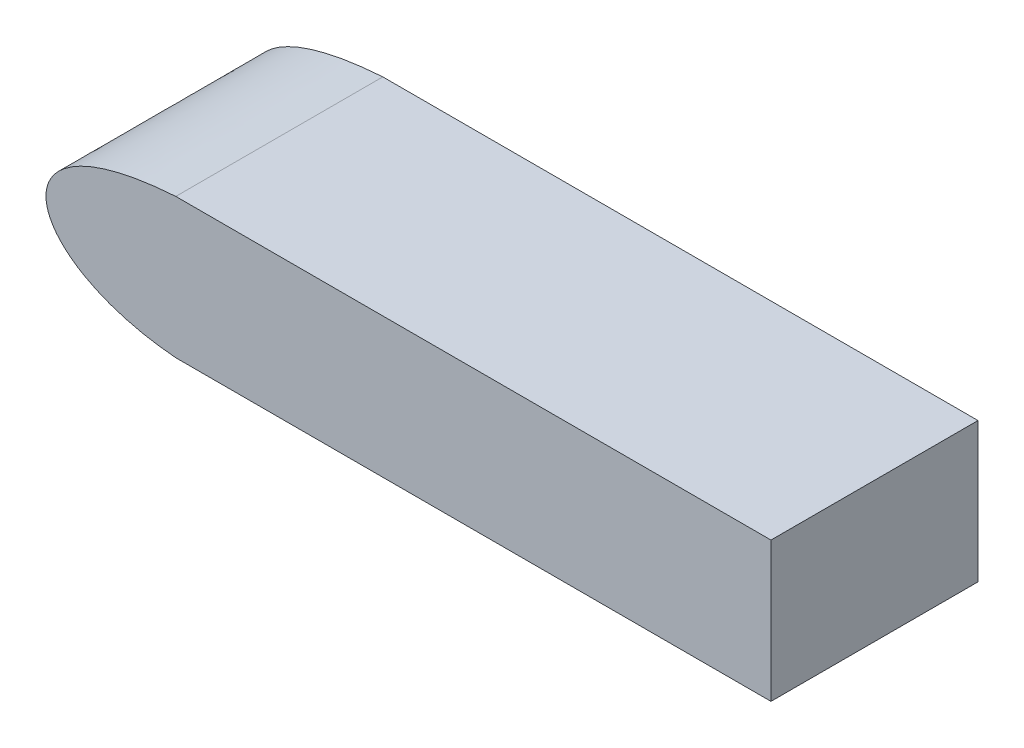
ISO-10303-21;
HEADER;
FILE_DESCRIPTION(('STEP AP214'),'2;1');
FILE_NAME('part.step','',(''),(''),'','','');
FILE_SCHEMA(('AUTOMOTIVE_DESIGN { 1 0 10303 214 1 1 1 1 }'));
ENDSEC;
DATA;
#1=APPLICATION_CONTEXT('core data for automotive mechanical design processes');
#2=APPLICATION_PROTOCOL_DEFINITION('international standard','automotive_design',2000,#1);
#3=PRODUCT_CONTEXT('',#1,'mechanical');
#4=PRODUCT('Part','Part','',(#3));
#5=PRODUCT_RELATED_PRODUCT_CATEGORY('part','',(#4));
#6=PRODUCT_DEFINITION_FORMATION('','',#4);
#7=PRODUCT_DEFINITION_CONTEXT('part definition',#1,'design');
#8=PRODUCT_DEFINITION('design','',#6,#7);
#9=PRODUCT_DEFINITION_SHAPE('','',#8);
#10=(LENGTH_UNIT() NAMED_UNIT(*) SI_UNIT(.MILLI.,.METRE.));
#11=(NAMED_UNIT(*) PLANE_ANGLE_UNIT() SI_UNIT($,.RADIAN.));
#12=(NAMED_UNIT(*) SI_UNIT($,.STERADIAN.) SOLID_ANGLE_UNIT());
#13=UNCERTAINTY_MEASURE_WITH_UNIT(LENGTH_MEASURE(1.E-05),#10,'distance_accuracy_value','');
#14=(GEOMETRIC_REPRESENTATION_CONTEXT(3) GLOBAL_UNCERTAINTY_ASSIGNED_CONTEXT((#13)) GLOBAL_UNIT_ASSIGNED_CONTEXT((#10,
#11,#12)) REPRESENTATION_CONTEXT('',''));
#15=CARTESIAN_POINT('',(0.,0.,0.));
#16=DIRECTION('',(0.,0.,1.));
#17=DIRECTION('',(1.,0.,0.));
#18=AXIS2_PLACEMENT_3D('',#15,#16,#17);
#19=CARTESIAN_POINT('',(0.,27.,-40.));
#20=CARTESIAN_POINT('',(-37.0657683373432,24.5493617235743,-40.));
#21=CARTESIAN_POINT('',(-29.6008983293235,2.45063827642568,-40.));
#22=CARTESIAN_POINT('',(0.,0.,-40.));
#23=B_SPLINE_CURVE_WITH_KNOTS('',3,(#19,#20,#21,#22),.UNSPECIFIED.,.F.,.F.,(4,4),(0.,1.),.UNSPECIFIED.);
#24=DIRECTION('',(0.,0.,1.));
#25=VECTOR('',#24,1.);
#26=SURFACE_OF_LINEAR_EXTRUSION('',#23,#25);
#27=CARTESIAN_POINT('',(0.,27.,0.));
#28=CARTESIAN_POINT('',(-37.0657683373432,24.5493617235743,0.));
#29=CARTESIAN_POINT('',(-29.6008983293235,2.45063827642568,0.));
#30=CARTESIAN_POINT('',(0.,0.,0.));
#31=B_SPLINE_CURVE_WITH_KNOTS('',3,(#27,#28,#29,#30),.UNSPECIFIED.,.F.,.F.,(4,4),(0.,1.),.UNSPECIFIED.);
#32=CARTESIAN_POINT('',(0.,27.,0.));
#33=VERTEX_POINT('',#32);
#34=CARTESIAN_POINT('',(0.,0.,0.));
#35=VERTEX_POINT('',#34);
#36=EDGE_CURVE('E101',#33,#35,#31,.T.);
#37=ORIENTED_EDGE('',*,*,#36,.F.);
#38=DIRECTION('',(0.,0.,1.));
#39=VECTOR('',#38,1.);
#40=CARTESIAN_POINT('',(0.,27.,-40.));
#41=LINE('',#40,#39);
#42=CARTESIAN_POINT('',(0.,27.,-40.));
#43=VERTEX_POINT('',#42);
#44=EDGE_CURVE('E11',#43,#33,#41,.T.);
#45=ORIENTED_EDGE('',*,*,#44,.F.);
#46=CARTESIAN_POINT('',(0.,0.,-40.));
#47=VERTEX_POINT('',#46);
#48=EDGE_CURVE('E93',#43,#47,#23,.T.);
#49=ORIENTED_EDGE('',*,*,#48,.T.);
#50=DIRECTION('',(0.,0.,1.));
#51=VECTOR('',#50,1.);
#52=CARTESIAN_POINT('',(0.,0.,-40.));
#53=LINE('',#52,#51);
#54=EDGE_CURVE('E38',#47,#35,#53,.T.);
#55=ORIENTED_EDGE('',*,*,#54,.T.);
#56=EDGE_LOOP('',(#37,#45,#49,#55));
#57=FACE_BOUND('',#56,.T.);
#58=ADVANCED_FACE('F34',(#57),#26,.T.);
#59=CARTESIAN_POINT('',(0.,27.,-40.));
#60=DIRECTION('',(0.,1.,0.));
#61=DIRECTION('',(0.,0.,1.));
#62=AXIS2_PLACEMENT_3D('',#59,#60,#61);
#63=PLANE('',#62);
#64=DIRECTION('',(-1.,0.,0.));
#65=VECTOR('',#64,1.);
#66=CARTESIAN_POINT('',(0.,27.,0.));
#67=LINE('',#66,#65);
#68=CARTESIAN_POINT('',(115.,27.,0.));
#69=VERTEX_POINT('',#68);
#70=EDGE_CURVE('E95',#69,#33,#67,.T.);
#71=ORIENTED_EDGE('',*,*,#70,.F.);
#72=DIRECTION('',(0.,0.,1.));
#73=VECTOR('',#72,1.);
#74=CARTESIAN_POINT('',(115.,27.,-40.));
#75=LINE('',#74,#73);
#76=CARTESIAN_POINT('',(115.,27.,-40.));
#77=VERTEX_POINT('',#76);
#78=EDGE_CURVE('E44',#77,#69,#75,.T.);
#79=ORIENTED_EDGE('',*,*,#78,.F.);
#80=DIRECTION('',(-1.,0.,0.));
#81=VECTOR('',#80,1.);
#82=CARTESIAN_POINT('',(0.,27.,-40.));
#83=LINE('',#82,#81);
#84=EDGE_CURVE('E90',#77,#43,#83,.T.);
#85=ORIENTED_EDGE('',*,*,#84,.T.);
#86=ORIENTED_EDGE('',*,*,#44,.T.);
#87=EDGE_LOOP('',(#71,#79,#85,#86));
#88=FACE_BOUND('',#87,.T.);
#89=ADVANCED_FACE('F116',(#88),#63,.T.);
#90=CARTESIAN_POINT('',(115.,0.,-40.));
#91=DIRECTION('',(1.,0.,0.));
#92=DIRECTION('',(0.,0.,-1.));
#93=AXIS2_PLACEMENT_3D('',#90,#91,#92);
#94=PLANE('',#93);
#95=DIRECTION('',(0.,1.,0.));
#96=VECTOR('',#95,1.);
#97=CARTESIAN_POINT('',(115.,0.,0.));
#98=LINE('',#97,#96);
#99=CARTESIAN_POINT('',(115.,0.,0.));
#100=VERTEX_POINT('',#99);
#101=EDGE_CURVE('E85',#100,#69,#98,.T.);
#102=ORIENTED_EDGE('',*,*,#101,.F.);
#103=DIRECTION('',(0.,0.,1.));
#104=VECTOR('',#103,1.);
#105=CARTESIAN_POINT('',(115.,0.,-40.));
#106=LINE('',#105,#104);
#107=CARTESIAN_POINT('',(115.,0.,-40.));
#108=VERTEX_POINT('',#107);
#109=EDGE_CURVE('E80',#108,#100,#106,.T.);
#110=ORIENTED_EDGE('',*,*,#109,.F.);
#111=DIRECTION('',(0.,1.,0.));
#112=VECTOR('',#111,1.);
#113=CARTESIAN_POINT('',(115.,0.,-40.));
#114=LINE('',#113,#112);
#115=EDGE_CURVE('E83',#108,#77,#114,.T.);
#116=ORIENTED_EDGE('',*,*,#115,.T.);
#117=ORIENTED_EDGE('',*,*,#78,.T.);
#118=EDGE_LOOP('',(#102,#110,#116,#117));
#119=FACE_BOUND('',#118,.T.);
#120=ADVANCED_FACE('F82',(#119),#94,.T.);
#121=CARTESIAN_POINT('',(0.,0.,-40.));
#122=DIRECTION('',(0.,-1.,0.));
#123=DIRECTION('',(0.,0.,-1.));
#124=AXIS2_PLACEMENT_3D('',#121,#122,#123);
#125=PLANE('',#124);
#126=DIRECTION('',(1.,0.,0.));
#127=VECTOR('',#126,1.);
#128=CARTESIAN_POINT('',(0.,0.,0.));
#129=LINE('',#128,#127);
#130=EDGE_CURVE('E106',#35,#100,#129,.T.);
#131=ORIENTED_EDGE('',*,*,#130,.F.);
#132=ORIENTED_EDGE('',*,*,#54,.F.);
#133=DIRECTION('',(1.,0.,0.));
#134=VECTOR('',#133,1.);
#135=CARTESIAN_POINT('',(0.,0.,-40.));
#136=LINE('',#135,#134);
#137=EDGE_CURVE('E89',#47,#108,#136,.T.);
#138=ORIENTED_EDGE('',*,*,#137,.T.);
#139=ORIENTED_EDGE('',*,*,#109,.T.);
#140=EDGE_LOOP('',(#131,#132,#138,#139));
#141=FACE_BOUND('',#140,.T.);
#142=ADVANCED_FACE('F92',(#141),#125,.T.);
#143=CARTESIAN_POINT('',(-25.,13.5,-40.));
#144=DIRECTION('',(0.,0.,1.));
#145=DIRECTION('',(1.,0.,0.));
#146=AXIS2_PLACEMENT_3D('',#143,#144,#145);
#147=PLANE('',#146);
#148=ORIENTED_EDGE('',*,*,#48,.F.);
#149=ORIENTED_EDGE('',*,*,#84,.F.);
#150=ORIENTED_EDGE('',*,*,#115,.F.);
#151=ORIENTED_EDGE('',*,*,#137,.F.);
#152=EDGE_LOOP('',(#148,#149,#150,#151));
#153=FACE_BOUND('',#152,.T.);
#154=ADVANCED_FACE('F88',(#153),#147,.F.);
#155=CARTESIAN_POINT('',(-25.,13.5,0.));
#156=DIRECTION('',(0.,0.,1.));
#157=DIRECTION('',(1.,0.,0.));
#158=AXIS2_PLACEMENT_3D('',#155,#156,#157);
#159=PLANE('',#158);
#160=ORIENTED_EDGE('',*,*,#36,.T.);
#161=ORIENTED_EDGE('',*,*,#130,.T.);
#162=ORIENTED_EDGE('',*,*,#101,.T.);
#163=ORIENTED_EDGE('',*,*,#70,.T.);
#164=EDGE_LOOP('',(#160,#161,#162,#163));
#165=FACE_BOUND('',#164,.T.);
#166=ADVANCED_FACE('F115',(#165),#159,.T.);
#167=CLOSED_SHELL('',(#58,#89,#120,#142,#154,#166));
#168=MANIFOLD_SOLID_BREP('B2',#167);
#169=ADVANCED_BREP_SHAPE_REPRESENTATION('',(#18,#168),#14);
#170=SHAPE_DEFINITION_REPRESENTATION(#9,#169);
ENDSEC;
END-ISO-10303-21;
